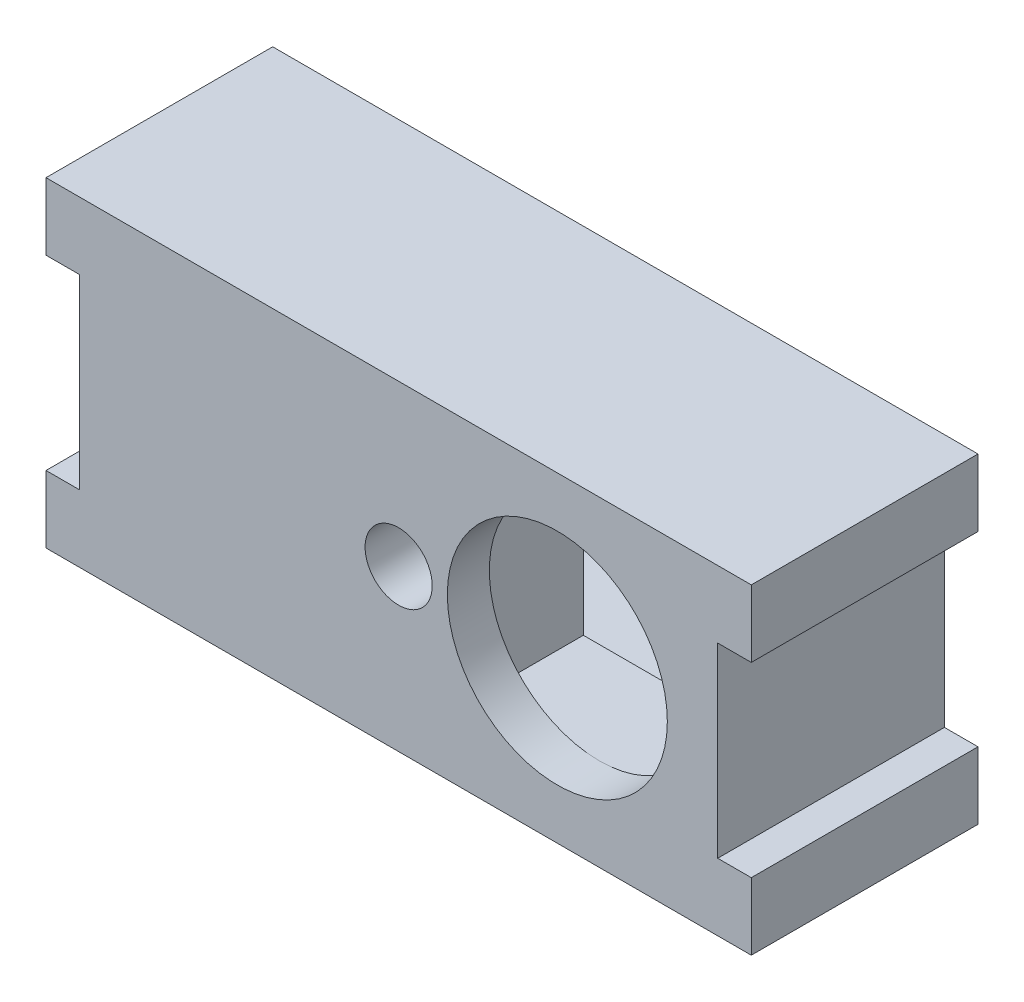
ISO-10303-21;
HEADER;
FILE_DESCRIPTION(('STEP AP214'),'2;1');
FILE_NAME('part.step','',(''),(''),'','','');
FILE_SCHEMA(('AUTOMOTIVE_DESIGN { 1 0 10303 214 1 1 1 1 }'));
ENDSEC;
DATA;
#1=APPLICATION_CONTEXT('core data for automotive mechanical design processes');
#2=APPLICATION_PROTOCOL_DEFINITION('international standard','automotive_design',2000,#1);
#3=PRODUCT_CONTEXT('',#1,'mechanical');
#4=PRODUCT('Part','Part','',(#3));
#5=PRODUCT_RELATED_PRODUCT_CATEGORY('part','',(#4));
#6=PRODUCT_DEFINITION_FORMATION('','',#4);
#7=PRODUCT_DEFINITION_CONTEXT('part definition',#1,'design');
#8=PRODUCT_DEFINITION('design','',#6,#7);
#9=PRODUCT_DEFINITION_SHAPE('','',#8);
#10=(LENGTH_UNIT() NAMED_UNIT(*) SI_UNIT(.MILLI.,.METRE.));
#11=(NAMED_UNIT(*) PLANE_ANGLE_UNIT() SI_UNIT($,.RADIAN.));
#12=(NAMED_UNIT(*) SI_UNIT($,.STERADIAN.) SOLID_ANGLE_UNIT());
#13=UNCERTAINTY_MEASURE_WITH_UNIT(LENGTH_MEASURE(1.E-05),#10,'distance_accuracy_value','');
#14=(GEOMETRIC_REPRESENTATION_CONTEXT(3) GLOBAL_UNCERTAINTY_ASSIGNED_CONTEXT((#13)) GLOBAL_UNIT_ASSIGNED_CONTEXT((#10,
#11,#12)) REPRESENTATION_CONTEXT('',''));
#15=CARTESIAN_POINT('',(0.,0.,0.));
#16=DIRECTION('',(0.,0.,1.));
#17=DIRECTION('',(1.,0.,0.));
#18=AXIS2_PLACEMENT_3D('',#15,#16,#17);
#19=CARTESIAN_POINT('',(-19.,9.55,-2.5));
#20=DIRECTION('',(-1.,0.,0.));
#21=DIRECTION('',(0.,-1.,0.));
#22=AXIS2_PLACEMENT_3D('',#19,#20,#21);
#23=PLANE('',#22);
#24=DIRECTION('',(0.,-1.,0.));
#25=VECTOR('',#24,1.);
#26=CARTESIAN_POINT('',(-19.,9.55,0.));
#27=LINE('',#26,#25);
#28=CARTESIAN_POINT('',(-19.,5.55,0.));
#29=VERTEX_POINT('',#28);
#30=CARTESIAN_POINT('',(-19.,-5.55,0.));
#31=VERTEX_POINT('',#30);
#32=EDGE_CURVE('E64',#29,#31,#27,.T.);
#33=ORIENTED_EDGE('',*,*,#32,.F.);
#34=DIRECTION('',(0.,0.,-1.));
#35=VECTOR('',#34,1.);
#36=CARTESIAN_POINT('',(-19.,5.55,4.47213595499958));
#37=LINE('',#36,#35);
#38=CARTESIAN_POINT('',(-19.,5.55,-2.5));
#39=VERTEX_POINT('',#38);
#40=EDGE_CURVE('E245',#29,#39,#37,.T.);
#41=ORIENTED_EDGE('',*,*,#40,.T.);
#42=DIRECTION('',(0.,-1.,0.));
#43=VECTOR('',#42,1.);
#44=CARTESIAN_POINT('',(-19.,9.55,-2.5));
#45=LINE('',#44,#43);
#46=CARTESIAN_POINT('',(-19.,-5.55,-2.5));
#47=VERTEX_POINT('',#46);
#48=EDGE_CURVE('E488',#39,#47,#45,.T.);
#49=ORIENTED_EDGE('',*,*,#48,.T.);
#50=DIRECTION('',(0.,0.,-1.));
#51=VECTOR('',#50,1.);
#52=CARTESIAN_POINT('',(-19.,-5.55,4.47213595499958));
#53=LINE('',#52,#51);
#54=EDGE_CURVE('E273',#31,#47,#53,.T.);
#55=ORIENTED_EDGE('',*,*,#54,.F.);
#56=EDGE_LOOP('',(#33,#41,#49,#55));
#57=FACE_BOUND('',#56,.T.);
#58=ADVANCED_FACE('F45',(#57),#23,.T.);
#59=CARTESIAN_POINT('',(19.,9.55,-2.5));
#60=DIRECTION('',(1.,0.,0.));
#61=DIRECTION('',(0.,0.,-1.));
#62=AXIS2_PLACEMENT_3D('',#59,#60,#61);
#63=PLANE('',#62);
#64=DIRECTION('',(0.,0.,-1.));
#65=VECTOR('',#64,1.);
#66=CARTESIAN_POINT('',(19.,5.55,4.47213595499958));
#67=LINE('',#66,#65);
#68=CARTESIAN_POINT('',(19.,5.55,0.));
#69=VERTEX_POINT('',#68);
#70=CARTESIAN_POINT('',(19.,5.55,-13.5));
#71=VERTEX_POINT('',#70);
#72=EDGE_CURVE('E288',#69,#71,#67,.T.);
#73=ORIENTED_EDGE('',*,*,#72,.F.);
#74=DIRECTION('',(0.,1.,0.));
#75=VECTOR('',#74,1.);
#76=CARTESIAN_POINT('',(19.,9.55,0.));
#77=LINE('',#76,#75);
#78=CARTESIAN_POINT('',(19.,-5.55,0.));
#79=VERTEX_POINT('',#78);
#80=EDGE_CURVE('E49',#79,#69,#77,.T.);
#81=ORIENTED_EDGE('',*,*,#80,.F.);
#82=DIRECTION('',(0.,0.,-1.));
#83=VECTOR('',#82,1.);
#84=CARTESIAN_POINT('',(19.,-5.55,4.47213595499958));
#85=LINE('',#84,#83);
#86=CARTESIAN_POINT('',(19.,-5.55,-13.5));
#87=VERTEX_POINT('',#86);
#88=EDGE_CURVE('E322',#79,#87,#85,.T.);
#89=ORIENTED_EDGE('',*,*,#88,.T.);
#90=DIRECTION('',(0.,-1.,0.));
#91=VECTOR('',#90,1.);
#92=CARTESIAN_POINT('',(19.,-9.55,-13.5));
#93=LINE('',#92,#91);
#94=EDGE_CURVE('E332',#71,#87,#93,.T.);
#95=ORIENTED_EDGE('',*,*,#94,.F.);
#96=EDGE_LOOP('',(#73,#81,#89,#95));
#97=FACE_BOUND('',#96,.T.);
#98=ADVANCED_FACE('F572',(#97),#63,.T.);
#99=CARTESIAN_POINT('',(0.,0.,-2.5));
#100=DIRECTION('',(0.,0.,-1.));
#101=DIRECTION('',(-1.,0.,0.));
#102=AXIS2_PLACEMENT_3D('',#99,#100,#101);
#103=PLANE('',#102);
#104=DIRECTION('',(1.,0.,0.));
#105=VECTOR('',#104,1.);
#106=CARTESIAN_POINT('',(2.5,6.55,-2.5));
#107=LINE('',#106,#105);
#108=CARTESIAN_POINT('',(9.45,6.55,-2.5));
#109=VERTEX_POINT('',#108);
#110=CARTESIAN_POINT('',(16.,6.55,-2.5));
#111=VERTEX_POINT('',#110);
#112=EDGE_CURVE('E432',#109,#111,#107,.T.);
#113=ORIENTED_EDGE('',*,*,#112,.T.);
#114=DIRECTION('',(0.,-1.,0.));
#115=VECTOR('',#114,1.);
#116=CARTESIAN_POINT('',(16.,6.55,-2.5));
#117=LINE('',#116,#115);
#118=CARTESIAN_POINT('',(16.,0.,-2.5));
#119=VERTEX_POINT('',#118);
#120=EDGE_CURVE('E57',#111,#119,#117,.T.);
#121=ORIENTED_EDGE('',*,*,#120,.T.);
#122=CARTESIAN_POINT('',(9.45,0.,-2.5));
#123=DIRECTION('',(0.,0.,1.));
#124=DIRECTION('',(1.,0.,0.));
#125=AXIS2_PLACEMENT_3D('',#122,#123,#124);
#126=CIRCLE('',#125,6.55);
#127=EDGE_CURVE('E478',#119,#109,#126,.T.);
#128=ORIENTED_EDGE('',*,*,#127,.T.);
#129=EDGE_LOOP('',(#113,#121,#128));
#130=FACE_BOUND('',#129,.T.);
#131=ADVANCED_FACE('F534',(#130),#103,.T.);
#132=CARTESIAN_POINT('',(9.45,-6.55,-2.5));
#133=VERTEX_POINT('',#132);
#134=EDGE_CURVE('E484',#133,#119,#126,.T.);
#135=ORIENTED_EDGE('',*,*,#134,.T.);
#136=CARTESIAN_POINT('',(16.,-6.55,-2.5));
#137=VERTEX_POINT('',#136);
#138=EDGE_CURVE('E11',#119,#137,#117,.T.);
#139=ORIENTED_EDGE('',*,*,#138,.T.);
#140=DIRECTION('',(-1.,0.,0.));
#141=VECTOR('',#140,1.);
#142=CARTESIAN_POINT('',(2.5,-6.55,-2.5));
#143=LINE('',#142,#141);
#144=EDGE_CURVE('E421',#137,#133,#143,.T.);
#145=ORIENTED_EDGE('',*,*,#144,.T.);
#146=EDGE_LOOP('',(#135,#139,#145));
#147=FACE_BOUND('',#146,.T.);
#148=ADVANCED_FACE('F539',(#147),#103,.T.);
#149=EDGE_CURVE('E483',#109,#133,#126,.T.);
#150=ORIENTED_EDGE('',*,*,#149,.T.);
#151=CARTESIAN_POINT('',(2.5,-6.55,-2.5));
#152=VERTEX_POINT('',#151);
#153=EDGE_CURVE('E55',#133,#152,#143,.T.);
#154=ORIENTED_EDGE('',*,*,#153,.T.);
#155=DIRECTION('',(0.,1.,0.));
#156=VECTOR('',#155,1.);
#157=CARTESIAN_POINT('',(2.5,6.55,-2.5));
#158=LINE('',#157,#156);
#159=CARTESIAN_POINT('',(2.5,6.55,-2.5));
#160=VERTEX_POINT('',#159);
#161=EDGE_CURVE('E425',#152,#160,#158,.T.);
#162=ORIENTED_EDGE('',*,*,#161,.T.);
#163=EDGE_CURVE('E408',#160,#109,#107,.T.);
#164=ORIENTED_EDGE('',*,*,#163,.T.);
#165=EDGE_LOOP('',(#150,#154,#162,#164));
#166=FACE_BOUND('',#165,.T.);
#167=ADVANCED_FACE('F525',(#166),#103,.T.);
#168=CARTESIAN_POINT('',(-19.,9.55,-2.5));
#169=DIRECTION('',(0.,1.,0.));
#170=DIRECTION('',(0.,0.,1.));
#171=AXIS2_PLACEMENT_3D('',#168,#169,#170);
#172=PLANE('',#171);
#173=DIRECTION('',(-1.,0.,0.));
#174=VECTOR('',#173,1.);
#175=CARTESIAN_POINT('',(-19.,9.55,0.));
#176=LINE('',#175,#174);
#177=CARTESIAN_POINT('',(21.,9.55,0.));
#178=VERTEX_POINT('',#177);
#179=CARTESIAN_POINT('',(-21.,9.55,0.));
#180=VERTEX_POINT('',#179);
#181=EDGE_CURVE('E482',#178,#180,#176,.T.);
#182=ORIENTED_EDGE('',*,*,#181,.F.);
#183=DIRECTION('',(0.,0.,-1.));
#184=VECTOR('',#183,1.);
#185=CARTESIAN_POINT('',(21.,9.55,4.47213595499958));
#186=LINE('',#185,#184);
#187=CARTESIAN_POINT('',(21.,9.55,-13.5));
#188=VERTEX_POINT('',#187);
#189=EDGE_CURVE('E300',#178,#188,#186,.T.);
#190=ORIENTED_EDGE('',*,*,#189,.T.);
#191=DIRECTION('',(1.,0.,0.));
#192=VECTOR('',#191,1.);
#193=CARTESIAN_POINT('',(19.,9.55,-13.5));
#194=LINE('',#193,#192);
#195=CARTESIAN_POINT('',(-21.,9.55,-13.5));
#196=VERTEX_POINT('',#195);
#197=EDGE_CURVE('E233',#196,#188,#194,.T.);
#198=ORIENTED_EDGE('',*,*,#197,.F.);
#199=DIRECTION('',(0.,0.,-1.));
#200=VECTOR('',#199,1.);
#201=CARTESIAN_POINT('',(-21.,9.55,4.47213595499958));
#202=LINE('',#201,#200);
#203=EDGE_CURVE('E244',#180,#196,#202,.T.);
#204=ORIENTED_EDGE('',*,*,#203,.F.);
#205=EDGE_LOOP('',(#182,#190,#198,#204));
#206=FACE_BOUND('',#205,.T.);
#207=ADVANCED_FACE('F47',(#206),#172,.T.);
#208=CARTESIAN_POINT('',(-19.,-9.55,-2.5));
#209=DIRECTION('',(0.,-1.,0.));
#210=DIRECTION('',(0.,0.,-1.));
#211=AXIS2_PLACEMENT_3D('',#208,#209,#210);
#212=PLANE('',#211);
#213=DIRECTION('',(1.,0.,0.));
#214=VECTOR('',#213,1.);
#215=CARTESIAN_POINT('',(-19.,-9.55,0.));
#216=LINE('',#215,#214);
#217=CARTESIAN_POINT('',(-21.,-9.55,0.));
#218=VERTEX_POINT('',#217);
#219=CARTESIAN_POINT('',(21.,-9.55,0.));
#220=VERTEX_POINT('',#219);
#221=EDGE_CURVE('E495',#218,#220,#216,.T.);
#222=ORIENTED_EDGE('',*,*,#221,.F.);
#223=DIRECTION('',(0.,0.,-1.));
#224=VECTOR('',#223,1.);
#225=CARTESIAN_POINT('',(-21.,-9.55,4.47213595499958));
#226=LINE('',#225,#224);
#227=CARTESIAN_POINT('',(-21.,-9.55,-13.5));
#228=VERTEX_POINT('',#227);
#229=EDGE_CURVE('E277',#218,#228,#226,.T.);
#230=ORIENTED_EDGE('',*,*,#229,.T.);
#231=DIRECTION('',(-1.,0.,0.));
#232=VECTOR('',#231,1.);
#233=CARTESIAN_POINT('',(19.,-9.55,-13.5));
#234=LINE('',#233,#232);
#235=CARTESIAN_POINT('',(21.,-9.55,-13.5));
#236=VERTEX_POINT('',#235);
#237=EDGE_CURVE('E336',#236,#228,#234,.T.);
#238=ORIENTED_EDGE('',*,*,#237,.F.);
#239=DIRECTION('',(0.,0.,-1.));
#240=VECTOR('',#239,1.);
#241=CARTESIAN_POINT('',(21.,-9.55,4.47213595499958));
#242=LINE('',#241,#240);
#243=EDGE_CURVE('E318',#220,#236,#242,.T.);
#244=ORIENTED_EDGE('',*,*,#243,.F.);
#245=EDGE_LOOP('',(#222,#230,#238,#244));
#246=FACE_BOUND('',#245,.T.);
#247=ADVANCED_FACE('F580',(#246),#212,.T.);
#248=DIRECTION('',(-1.,0.,0.));
#249=VECTOR('',#248,1.);
#250=CARTESIAN_POINT('',(-2.5,5.55,-2.5));
#251=LINE('',#250,#249);
#252=CARTESIAN_POINT('',(-2.5,5.55,-2.5));
#253=VERTEX_POINT('',#252);
#254=EDGE_CURVE('E450',#253,#39,#251,.T.);
#255=ORIENTED_EDGE('',*,*,#254,.F.);
#256=DIRECTION('',(0.,1.,0.));
#257=VECTOR('',#256,1.);
#258=CARTESIAN_POINT('',(-2.5,-5.55,-2.5));
#259=LINE('',#258,#257);
#260=CARTESIAN_POINT('',(-2.5,-5.55,-2.5));
#261=VERTEX_POINT('',#260);
#262=EDGE_CURVE('E460',#261,#253,#259,.T.);
#263=ORIENTED_EDGE('',*,*,#262,.F.);
#264=DIRECTION('',(1.,0.,0.));
#265=VECTOR('',#264,1.);
#266=CARTESIAN_POINT('',(-19.,-5.55,-2.5));
#267=LINE('',#266,#265);
#268=EDGE_CURVE('E445',#47,#261,#267,.T.);
#269=ORIENTED_EDGE('',*,*,#268,.F.);
#270=ORIENTED_EDGE('',*,*,#48,.F.);
#271=EDGE_LOOP('',(#255,#263,#269,#270));
#272=FACE_BOUND('',#271,.T.);
#273=ADVANCED_FACE('F582',(#272),#103,.T.);
#274=CARTESIAN_POINT('',(0.,0.,0.));
#275=DIRECTION('',(0.,0.,-1.));
#276=DIRECTION('',(-1.,0.,0.));
#277=AXIS2_PLACEMENT_3D('',#274,#275,#276);
#278=PLANE('',#277);
#279=CARTESIAN_POINT('',(0.,0.,0.));
#280=DIRECTION('',(0.,0.,1.));
#281=DIRECTION('',(1.,0.,0.));
#282=AXIS2_PLACEMENT_3D('',#279,#280,#281);
#283=CIRCLE('',#282,2.);
#284=CARTESIAN_POINT('',(2.,0.,0.));
#285=VERTEX_POINT('',#284);
#286=EDGE_CURVE('E473',#285,#285,#283,.T.);
#287=ORIENTED_EDGE('',*,*,#286,.F.);
#288=EDGE_LOOP('',(#287));
#289=FACE_BOUND('',#288,.T.);
#290=CARTESIAN_POINT('',(9.45,0.,0.));
#291=DIRECTION('',(0.,0.,1.));
#292=DIRECTION('',(1.,0.,0.));
#293=AXIS2_PLACEMENT_3D('',#290,#291,#292);
#294=CIRCLE('',#293,6.55);
#295=CARTESIAN_POINT('',(16.,0.,0.));
#296=VERTEX_POINT('',#295);
#297=EDGE_CURVE('E477',#296,#296,#294,.T.);
#298=ORIENTED_EDGE('',*,*,#297,.F.);
#299=EDGE_LOOP('',(#298));
#300=FACE_BOUND('',#299,.T.);
#301=ORIENTED_EDGE('',*,*,#181,.T.);
#302=DIRECTION('',(0.,1.,0.));
#303=VECTOR('',#302,1.);
#304=CARTESIAN_POINT('',(-21.,9.55,0.));
#305=LINE('',#304,#303);
#306=CARTESIAN_POINT('',(-21.,5.55,0.));
#307=VERTEX_POINT('',#306);
#308=EDGE_CURVE('E260',#307,#180,#305,.T.);
#309=ORIENTED_EDGE('',*,*,#308,.F.);
#310=DIRECTION('',(-1.,0.,0.));
#311=VECTOR('',#310,1.);
#312=CARTESIAN_POINT('',(-21.,5.55,0.));
#313=LINE('',#312,#311);
#314=EDGE_CURVE('E240',#29,#307,#313,.T.);
#315=ORIENTED_EDGE('',*,*,#314,.F.);
#316=ORIENTED_EDGE('',*,*,#32,.T.);
#317=DIRECTION('',(1.,0.,0.));
#318=VECTOR('',#317,1.);
#319=CARTESIAN_POINT('',(-21.,-5.55,0.));
#320=LINE('',#319,#318);
#321=CARTESIAN_POINT('',(-21.,-5.55,0.));
#322=VERTEX_POINT('',#321);
#323=EDGE_CURVE('E251',#322,#31,#320,.T.);
#324=ORIENTED_EDGE('',*,*,#323,.F.);
#325=DIRECTION('',(0.,1.,0.));
#326=VECTOR('',#325,1.);
#327=CARTESIAN_POINT('',(-21.,-9.55,0.));
#328=LINE('',#327,#326);
#329=EDGE_CURVE('E256',#218,#322,#328,.T.);
#330=ORIENTED_EDGE('',*,*,#329,.F.);
#331=ORIENTED_EDGE('',*,*,#221,.T.);
#332=DIRECTION('',(0.,1.,0.));
#333=VECTOR('',#332,1.);
#334=CARTESIAN_POINT('',(21.,-9.55,0.));
#335=LINE('',#334,#333);
#336=CARTESIAN_POINT('',(21.,-5.55,0.));
#337=VERTEX_POINT('',#336);
#338=EDGE_CURVE('E310',#220,#337,#335,.T.);
#339=ORIENTED_EDGE('',*,*,#338,.T.);
#340=DIRECTION('',(-1.,0.,0.));
#341=VECTOR('',#340,1.);
#342=CARTESIAN_POINT('',(21.,-5.55,0.));
#343=LINE('',#342,#341);
#344=EDGE_CURVE('E313',#337,#79,#343,.T.);
#345=ORIENTED_EDGE('',*,*,#344,.T.);
#346=ORIENTED_EDGE('',*,*,#80,.T.);
#347=DIRECTION('',(1.,0.,0.));
#348=VECTOR('',#347,1.);
#349=CARTESIAN_POINT('',(21.,5.55,0.));
#350=LINE('',#349,#348);
#351=CARTESIAN_POINT('',(21.,5.55,0.));
#352=VERTEX_POINT('',#351);
#353=EDGE_CURVE('E287',#69,#352,#350,.T.);
#354=ORIENTED_EDGE('',*,*,#353,.T.);
#355=DIRECTION('',(0.,1.,0.));
#356=VECTOR('',#355,1.);
#357=CARTESIAN_POINT('',(21.,9.55,0.));
#358=LINE('',#357,#356);
#359=EDGE_CURVE('E283',#352,#178,#358,.T.);
#360=ORIENTED_EDGE('',*,*,#359,.T.);
#361=EDGE_LOOP('',(#301,#309,#315,#316,#324,#330,#331,#339,#345,#346,#354,#360));
#362=FACE_BOUND('',#361,.T.);
#363=ADVANCED_FACE('F504',(#289,#300,#362),#278,.F.);
#364=CARTESIAN_POINT('',(9.45,0.,-2.5));
#365=DIRECTION('',(0.,0.,1.));
#366=DIRECTION('',(1.,0.,0.));
#367=AXIS2_PLACEMENT_3D('',#364,#365,#366);
#368=CYLINDRICAL_SURFACE('',#367,6.55);
#369=ORIENTED_EDGE('',*,*,#127,.F.);
#370=ORIENTED_EDGE('',*,*,#134,.F.);
#371=ORIENTED_EDGE('',*,*,#149,.F.);
#372=EDGE_LOOP('',(#369,#370,#371));
#373=FACE_BOUND('',#372,.T.);
#374=ORIENTED_EDGE('',*,*,#297,.T.);
#375=EDGE_LOOP('',(#374));
#376=FACE_BOUND('',#375,.T.);
#377=ADVANCED_FACE('F530',(#373,#376),#368,.F.);
#378=CARTESIAN_POINT('',(0.,0.,-2.5));
#379=DIRECTION('',(0.,0.,1.));
#380=DIRECTION('',(1.,0.,0.));
#381=AXIS2_PLACEMENT_3D('',#378,#379,#380);
#382=CYLINDRICAL_SURFACE('',#381,2.);
#383=ORIENTED_EDGE('',*,*,#286,.T.);
#384=EDGE_LOOP('',(#383));
#385=FACE_BOUND('',#384,.T.);
#386=CARTESIAN_POINT('',(0.,0.,-8.5));
#387=DIRECTION('',(0.,0.,-1.));
#388=DIRECTION('',(-1.,0.,0.));
#389=AXIS2_PLACEMENT_3D('',#386,#387,#388);
#390=CIRCLE('',#389,2.);
#391=CARTESIAN_POINT('',(-2.,0.,-8.5));
#392=VERTEX_POINT('',#391);
#393=EDGE_CURVE('E400',#392,#392,#390,.T.);
#394=ORIENTED_EDGE('',*,*,#393,.T.);
#395=EDGE_LOOP('',(#394));
#396=FACE_BOUND('',#395,.T.);
#397=ADVANCED_FACE('F593',(#385,#396),#382,.F.);
#398=CARTESIAN_POINT('',(0.,0.,-8.5));
#399=DIRECTION('',(0.,0.,-1.));
#400=DIRECTION('',(-1.,0.,0.));
#401=AXIS2_PLACEMENT_3D('',#398,#399,#400);
#402=PLANE('',#401);
#403=DIRECTION('',(0.,-1.,0.));
#404=VECTOR('',#403,1.);
#405=CARTESIAN_POINT('',(-16.5,5.55,-8.5));
#406=LINE('',#405,#404);
#407=CARTESIAN_POINT('',(-16.5,7.05,-8.5));
#408=VERTEX_POINT('',#407);
#409=CARTESIAN_POINT('',(-16.5,5.55,-8.5));
#410=VERTEX_POINT('',#409);
#411=EDGE_CURVE('E337',#408,#410,#406,.T.);
#412=ORIENTED_EDGE('',*,*,#411,.F.);
#413=DIRECTION('',(-1.,0.,0.));
#414=VECTOR('',#413,1.);
#415=CARTESIAN_POINT('',(-16.5,7.05,-8.5));
#416=LINE('',#415,#414);
#417=CARTESIAN_POINT('',(16.5,7.05,-8.5));
#418=VERTEX_POINT('',#417);
#419=EDGE_CURVE('E371',#418,#408,#416,.T.);
#420=ORIENTED_EDGE('',*,*,#419,.F.);
#421=DIRECTION('',(0.,1.,0.));
#422=VECTOR('',#421,1.);
#423=CARTESIAN_POINT('',(16.5,7.05,-8.5));
#424=LINE('',#423,#422);
#425=CARTESIAN_POINT('',(16.5,-7.05,-8.5));
#426=VERTEX_POINT('',#425);
#427=EDGE_CURVE('E367',#426,#418,#424,.T.);
#428=ORIENTED_EDGE('',*,*,#427,.F.);
#429=DIRECTION('',(1.,0.,0.));
#430=VECTOR('',#429,1.);
#431=CARTESIAN_POINT('',(16.5,-7.05,-8.5));
#432=LINE('',#431,#430);
#433=CARTESIAN_POINT('',(-16.5,-7.05,-8.5));
#434=VERTEX_POINT('',#433);
#435=EDGE_CURVE('E363',#434,#426,#432,.T.);
#436=ORIENTED_EDGE('',*,*,#435,.F.);
#437=DIRECTION('',(0.,-1.,0.));
#438=VECTOR('',#437,1.);
#439=CARTESIAN_POINT('',(-16.5,-7.05,-8.5));
#440=LINE('',#439,#438);
#441=CARTESIAN_POINT('',(-16.5,-5.55,-8.5));
#442=VERTEX_POINT('',#441);
#443=EDGE_CURVE('E291',#442,#434,#440,.T.);
#444=ORIENTED_EDGE('',*,*,#443,.F.);
#445=DIRECTION('',(1.,0.,0.));
#446=VECTOR('',#445,1.);
#447=CARTESIAN_POINT('',(-19.,-5.55,-8.5));
#448=LINE('',#447,#446);
#449=CARTESIAN_POINT('',(-2.5,-5.55,-8.5));
#450=VERTEX_POINT('',#449);
#451=EDGE_CURVE('E446',#442,#450,#448,.T.);
#452=ORIENTED_EDGE('',*,*,#451,.T.);
#453=DIRECTION('',(0.,1.,0.));
#454=VECTOR('',#453,1.);
#455=CARTESIAN_POINT('',(-2.5,-5.55,-8.5));
#456=LINE('',#455,#454);
#457=CARTESIAN_POINT('',(-2.5,5.55,-8.5));
#458=VERTEX_POINT('',#457);
#459=EDGE_CURVE('E449',#450,#458,#456,.T.);
#460=ORIENTED_EDGE('',*,*,#459,.T.);
#461=DIRECTION('',(-1.,0.,0.));
#462=VECTOR('',#461,1.);
#463=CARTESIAN_POINT('',(-2.5,5.55,-8.5));
#464=LINE('',#463,#462);
#465=EDGE_CURVE('E453',#458,#410,#464,.T.);
#466=ORIENTED_EDGE('',*,*,#465,.T.);
#467=EDGE_LOOP('',(#412,#420,#428,#436,#444,#452,#460,#466));
#468=FACE_BOUND('',#467,.T.);
#469=DIRECTION('',(-1.,0.,0.));
#470=VECTOR('',#469,1.);
#471=CARTESIAN_POINT('',(2.5,-6.55,-8.5));
#472=LINE('',#471,#470);
#473=CARTESIAN_POINT('',(16.,-6.55,-8.5));
#474=VERTEX_POINT('',#473);
#475=CARTESIAN_POINT('',(2.5,-6.55,-8.5));
#476=VERTEX_POINT('',#475);
#477=EDGE_CURVE('E407',#474,#476,#472,.T.);
#478=ORIENTED_EDGE('',*,*,#477,.F.);
#479=DIRECTION('',(0.,-1.,0.));
#480=VECTOR('',#479,1.);
#481=CARTESIAN_POINT('',(16.,6.55,-8.5));
#482=LINE('',#481,#480);
#483=CARTESIAN_POINT('',(16.,6.55,-8.5));
#484=VERTEX_POINT('',#483);
#485=EDGE_CURVE('E404',#484,#474,#482,.T.);
#486=ORIENTED_EDGE('',*,*,#485,.F.);
#487=DIRECTION('',(1.,0.,0.));
#488=VECTOR('',#487,1.);
#489=CARTESIAN_POINT('',(2.5,6.55,-8.5));
#490=LINE('',#489,#488);
#491=CARTESIAN_POINT('',(2.5,6.55,-8.5));
#492=VERTEX_POINT('',#491);
#493=EDGE_CURVE('E415',#492,#484,#490,.T.);
#494=ORIENTED_EDGE('',*,*,#493,.F.);
#495=DIRECTION('',(0.,1.,0.));
#496=VECTOR('',#495,1.);
#497=CARTESIAN_POINT('',(2.5,6.55,-8.5));
#498=LINE('',#497,#496);
#499=EDGE_CURVE('E411',#476,#492,#498,.T.);
#500=ORIENTED_EDGE('',*,*,#499,.F.);
#501=EDGE_LOOP('',(#478,#486,#494,#500));
#502=FACE_BOUND('',#501,.T.);
#503=ORIENTED_EDGE('',*,*,#393,.F.);
#504=EDGE_LOOP('',(#503));
#505=FACE_BOUND('',#504,.T.);
#506=ADVANCED_FACE('F548',(#468,#502,#505),#402,.T.);
#507=CARTESIAN_POINT('',(-19.,-5.55,-8.5));
#508=DIRECTION('',(0.,-1.,0.));
#509=DIRECTION('',(1.,0.,0.));
#510=AXIS2_PLACEMENT_3D('',#507,#508,#509);
#511=PLANE('',#510);
#512=ORIENTED_EDGE('',*,*,#268,.T.);
#513=DIRECTION('',(0.,0.,1.));
#514=VECTOR('',#513,1.);
#515=CARTESIAN_POINT('',(-2.5,-5.55,-8.5));
#516=LINE('',#515,#514);
#517=EDGE_CURVE('E469',#450,#261,#516,.T.);
#518=ORIENTED_EDGE('',*,*,#517,.F.);
#519=ORIENTED_EDGE('',*,*,#451,.F.);
#520=DIRECTION('',(0.,0.,1.));
#521=VECTOR('',#520,1.);
#522=CARTESIAN_POINT('',(-16.5,-5.55,-13.5));
#523=LINE('',#522,#521);
#524=CARTESIAN_POINT('',(-16.5,-5.55,-13.5));
#525=VERTEX_POINT('',#524);
#526=EDGE_CURVE('E396',#525,#442,#523,.T.);
#527=ORIENTED_EDGE('',*,*,#526,.F.);
#528=DIRECTION('',(1.,0.,0.));
#529=VECTOR('',#528,1.);
#530=CARTESIAN_POINT('',(-19.,-5.55,-13.5));
#531=LINE('',#530,#529);
#532=CARTESIAN_POINT('',(-21.,-5.55,-13.5));
#533=VERTEX_POINT('',#532);
#534=EDGE_CURVE('E340',#533,#525,#531,.T.);
#535=ORIENTED_EDGE('',*,*,#534,.F.);
#536=DIRECTION('',(0.,0.,-1.));
#537=VECTOR('',#536,1.);
#538=CARTESIAN_POINT('',(-21.,-5.55,4.47213595499958));
#539=LINE('',#538,#537);
#540=EDGE_CURVE('E267',#322,#533,#539,.T.);
#541=ORIENTED_EDGE('',*,*,#540,.F.);
#542=ORIENTED_EDGE('',*,*,#323,.T.);
#543=ORIENTED_EDGE('',*,*,#54,.T.);
#544=EDGE_LOOP('',(#512,#518,#519,#527,#535,#541,#542,#543));
#545=FACE_BOUND('',#544,.T.);
#546=ADVANCED_FACE('F597',(#545),#511,.F.);
#547=CARTESIAN_POINT('',(-2.5,-5.55,-8.5));
#548=DIRECTION('',(1.,0.,0.));
#549=DIRECTION('',(0.,1.,0.));
#550=AXIS2_PLACEMENT_3D('',#547,#548,#549);
#551=PLANE('',#550);
#552=ORIENTED_EDGE('',*,*,#262,.T.);
#553=DIRECTION('',(0.,0.,1.));
#554=VECTOR('',#553,1.);
#555=CARTESIAN_POINT('',(-2.5,5.55,-8.5));
#556=LINE('',#555,#554);
#557=EDGE_CURVE('E456',#458,#253,#556,.T.);
#558=ORIENTED_EDGE('',*,*,#557,.F.);
#559=ORIENTED_EDGE('',*,*,#459,.F.);
#560=ORIENTED_EDGE('',*,*,#517,.T.);
#561=EDGE_LOOP('',(#552,#558,#559,#560));
#562=FACE_BOUND('',#561,.T.);
#563=ADVANCED_FACE('F600',(#562),#551,.F.);
#564=CARTESIAN_POINT('',(-2.5,5.55,-8.5));
#565=DIRECTION('',(0.,1.,0.));
#566=DIRECTION('',(0.,0.,1.));
#567=AXIS2_PLACEMENT_3D('',#564,#565,#566);
#568=PLANE('',#567);
#569=ORIENTED_EDGE('',*,*,#254,.T.);
#570=ORIENTED_EDGE('',*,*,#40,.F.);
#571=ORIENTED_EDGE('',*,*,#314,.T.);
#572=DIRECTION('',(0.,0.,-1.));
#573=VECTOR('',#572,1.);
#574=CARTESIAN_POINT('',(-21.,5.55,4.47213595499958));
#575=LINE('',#574,#573);
#576=CARTESIAN_POINT('',(-21.,5.55,-13.5));
#577=VERTEX_POINT('',#576);
#578=EDGE_CURVE('E237',#307,#577,#575,.T.);
#579=ORIENTED_EDGE('',*,*,#578,.T.);
#580=DIRECTION('',(-1.,0.,0.));
#581=VECTOR('',#580,1.);
#582=CARTESIAN_POINT('',(-19.,5.55,-13.5));
#583=LINE('',#582,#581);
#584=CARTESIAN_POINT('',(-16.5,5.55,-13.5));
#585=VERTEX_POINT('',#584);
#586=EDGE_CURVE('E222',#585,#577,#583,.T.);
#587=ORIENTED_EDGE('',*,*,#586,.F.);
#588=DIRECTION('',(0.,0.,1.));
#589=VECTOR('',#588,1.);
#590=CARTESIAN_POINT('',(-16.5,5.55,-13.5));
#591=LINE('',#590,#589);
#592=EDGE_CURVE('E359',#585,#410,#591,.T.);
#593=ORIENTED_EDGE('',*,*,#592,.T.);
#594=ORIENTED_EDGE('',*,*,#465,.F.);
#595=ORIENTED_EDGE('',*,*,#557,.T.);
#596=EDGE_LOOP('',(#569,#570,#571,#579,#587,#593,#594,#595));
#597=FACE_BOUND('',#596,.T.);
#598=ADVANCED_FACE('F238',(#597),#568,.F.);
#599=CARTESIAN_POINT('',(16.,6.55,-8.5));
#600=DIRECTION('',(-1.,0.,0.));
#601=DIRECTION('',(0.,0.,1.));
#602=AXIS2_PLACEMENT_3D('',#599,#600,#601);
#603=PLANE('',#602);
#604=ORIENTED_EDGE('',*,*,#120,.F.);
#605=DIRECTION('',(0.,0.,1.));
#606=VECTOR('',#605,1.);
#607=CARTESIAN_POINT('',(16.,6.55,-8.5));
#608=LINE('',#607,#606);
#609=EDGE_CURVE('E417',#484,#111,#608,.T.);
#610=ORIENTED_EDGE('',*,*,#609,.F.);
#611=ORIENTED_EDGE('',*,*,#485,.T.);
#612=DIRECTION('',(0.,0.,1.));
#613=VECTOR('',#612,1.);
#614=CARTESIAN_POINT('',(16.,-6.55,-8.5));
#615=LINE('',#614,#613);
#616=EDGE_CURVE('E441',#474,#137,#615,.T.);
#617=ORIENTED_EDGE('',*,*,#616,.T.);
#618=ORIENTED_EDGE('',*,*,#138,.F.);
#619=EDGE_LOOP('',(#604,#610,#611,#617,#618));
#620=FACE_BOUND('',#619,.T.);
#621=ADVANCED_FACE('F544',(#620),#603,.T.);
#622=CARTESIAN_POINT('',(2.5,-6.55,-8.5));
#623=DIRECTION('',(0.,1.,0.));
#624=DIRECTION('',(0.,0.,1.));
#625=AXIS2_PLACEMENT_3D('',#622,#623,#624);
#626=PLANE('',#625);
#627=ORIENTED_EDGE('',*,*,#144,.F.);
#628=ORIENTED_EDGE('',*,*,#616,.F.);
#629=ORIENTED_EDGE('',*,*,#477,.T.);
#630=DIRECTION('',(0.,0.,1.));
#631=VECTOR('',#630,1.);
#632=CARTESIAN_POINT('',(2.5,-6.55,-8.5));
#633=LINE('',#632,#631);
#634=EDGE_CURVE('E438',#476,#152,#633,.T.);
#635=ORIENTED_EDGE('',*,*,#634,.T.);
#636=ORIENTED_EDGE('',*,*,#153,.F.);
#637=EDGE_LOOP('',(#627,#628,#629,#635,#636));
#638=FACE_BOUND('',#637,.T.);
#639=ADVANCED_FACE('F542',(#638),#626,.T.);
#640=CARTESIAN_POINT('',(2.5,6.55,-8.5));
#641=DIRECTION('',(1.,0.,0.));
#642=DIRECTION('',(0.,1.,0.));
#643=AXIS2_PLACEMENT_3D('',#640,#641,#642);
#644=PLANE('',#643);
#645=ORIENTED_EDGE('',*,*,#161,.F.);
#646=ORIENTED_EDGE('',*,*,#634,.F.);
#647=ORIENTED_EDGE('',*,*,#499,.T.);
#648=DIRECTION('',(0.,0.,1.));
#649=VECTOR('',#648,1.);
#650=CARTESIAN_POINT('',(2.5,6.55,-8.5));
#651=LINE('',#650,#649);
#652=EDGE_CURVE('E435',#492,#160,#651,.T.);
#653=ORIENTED_EDGE('',*,*,#652,.T.);
#654=EDGE_LOOP('',(#645,#646,#647,#653));
#655=FACE_BOUND('',#654,.T.);
#656=ADVANCED_FACE('F554',(#655),#644,.T.);
#657=CARTESIAN_POINT('',(2.5,6.55,-8.5));
#658=DIRECTION('',(0.,-1.,0.));
#659=DIRECTION('',(1.,0.,0.));
#660=AXIS2_PLACEMENT_3D('',#657,#658,#659);
#661=PLANE('',#660);
#662=ORIENTED_EDGE('',*,*,#163,.F.);
#663=ORIENTED_EDGE('',*,*,#652,.F.);
#664=ORIENTED_EDGE('',*,*,#493,.T.);
#665=ORIENTED_EDGE('',*,*,#609,.T.);
#666=ORIENTED_EDGE('',*,*,#112,.F.);
#667=EDGE_LOOP('',(#662,#663,#664,#665,#666));
#668=FACE_BOUND('',#667,.T.);
#669=ADVANCED_FACE('F556',(#668),#661,.T.);
#670=CARTESIAN_POINT('',(-16.5,-7.05,-13.5));
#671=DIRECTION('',(-1.,0.,0.));
#672=DIRECTION('',(0.,0.,1.));
#673=AXIS2_PLACEMENT_3D('',#670,#671,#672);
#674=PLANE('',#673);
#675=ORIENTED_EDGE('',*,*,#443,.T.);
#676=DIRECTION('',(0.,0.,1.));
#677=VECTOR('',#676,1.);
#678=CARTESIAN_POINT('',(-16.5,-7.05,-13.5));
#679=LINE('',#678,#677);
#680=CARTESIAN_POINT('',(-16.5,-7.05,-13.5));
#681=VERTEX_POINT('',#680);
#682=EDGE_CURVE('E392',#681,#434,#679,.T.);
#683=ORIENTED_EDGE('',*,*,#682,.F.);
#684=DIRECTION('',(0.,-1.,0.));
#685=VECTOR('',#684,1.);
#686=CARTESIAN_POINT('',(-16.5,-7.05,-13.5));
#687=LINE('',#686,#685);
#688=EDGE_CURVE('E343',#525,#681,#687,.T.);
#689=ORIENTED_EDGE('',*,*,#688,.F.);
#690=ORIENTED_EDGE('',*,*,#526,.T.);
#691=EDGE_LOOP('',(#675,#683,#689,#690));
#692=FACE_BOUND('',#691,.T.);
#693=ADVANCED_FACE('F560',(#692),#674,.F.);
#694=CARTESIAN_POINT('',(16.5,-7.05,-13.5));
#695=DIRECTION('',(0.,-1.,0.));
#696=DIRECTION('',(0.,0.,-1.));
#697=AXIS2_PLACEMENT_3D('',#694,#695,#696);
#698=PLANE('',#697);
#699=ORIENTED_EDGE('',*,*,#435,.T.);
#700=DIRECTION('',(0.,0.,1.));
#701=VECTOR('',#700,1.);
#702=CARTESIAN_POINT('',(16.5,-7.05,-13.5));
#703=LINE('',#702,#701);
#704=CARTESIAN_POINT('',(16.5,-7.05,-13.5));
#705=VERTEX_POINT('',#704);
#706=EDGE_CURVE('E388',#705,#426,#703,.T.);
#707=ORIENTED_EDGE('',*,*,#706,.F.);
#708=DIRECTION('',(1.,0.,0.));
#709=VECTOR('',#708,1.);
#710=CARTESIAN_POINT('',(16.5,-7.05,-13.5));
#711=LINE('',#710,#709);
#712=EDGE_CURVE('E346',#681,#705,#711,.T.);
#713=ORIENTED_EDGE('',*,*,#712,.F.);
#714=ORIENTED_EDGE('',*,*,#682,.T.);
#715=EDGE_LOOP('',(#699,#707,#713,#714));
#716=FACE_BOUND('',#715,.T.);
#717=ADVANCED_FACE('F567',(#716),#698,.F.);
#718=CARTESIAN_POINT('',(16.5,7.05,-13.5));
#719=DIRECTION('',(1.,0.,0.));
#720=DIRECTION('',(0.,0.,-1.));
#721=AXIS2_PLACEMENT_3D('',#718,#719,#720);
#722=PLANE('',#721);
#723=ORIENTED_EDGE('',*,*,#427,.T.);
#724=DIRECTION('',(0.,0.,1.));
#725=VECTOR('',#724,1.);
#726=CARTESIAN_POINT('',(16.5,7.05,-13.5));
#727=LINE('',#726,#725);
#728=CARTESIAN_POINT('',(16.5,7.05,-13.5));
#729=VERTEX_POINT('',#728);
#730=EDGE_CURVE('E384',#729,#418,#727,.T.);
#731=ORIENTED_EDGE('',*,*,#730,.F.);
#732=DIRECTION('',(0.,1.,0.));
#733=VECTOR('',#732,1.);
#734=CARTESIAN_POINT('',(16.5,7.05,-13.5));
#735=LINE('',#734,#733);
#736=EDGE_CURVE('E349',#705,#729,#735,.T.);
#737=ORIENTED_EDGE('',*,*,#736,.F.);
#738=ORIENTED_EDGE('',*,*,#706,.T.);
#739=EDGE_LOOP('',(#723,#731,#737,#738));
#740=FACE_BOUND('',#739,.T.);
#741=ADVANCED_FACE('F691',(#740),#722,.F.);
#742=CARTESIAN_POINT('',(-16.5,7.05,-13.5));
#743=DIRECTION('',(0.,1.,0.));
#744=DIRECTION('',(0.,0.,1.));
#745=AXIS2_PLACEMENT_3D('',#742,#743,#744);
#746=PLANE('',#745);
#747=ORIENTED_EDGE('',*,*,#419,.T.);
#748=DIRECTION('',(0.,0.,1.));
#749=VECTOR('',#748,1.);
#750=CARTESIAN_POINT('',(-16.5,7.05,-13.5));
#751=LINE('',#750,#749);
#752=CARTESIAN_POINT('',(-16.5,7.05,-13.5));
#753=VERTEX_POINT('',#752);
#754=EDGE_CURVE('E380',#753,#408,#751,.T.);
#755=ORIENTED_EDGE('',*,*,#754,.F.);
#756=DIRECTION('',(-1.,0.,0.));
#757=VECTOR('',#756,1.);
#758=CARTESIAN_POINT('',(-16.5,7.05,-13.5));
#759=LINE('',#758,#757);
#760=EDGE_CURVE('E352',#729,#753,#759,.T.);
#761=ORIENTED_EDGE('',*,*,#760,.F.);
#762=ORIENTED_EDGE('',*,*,#730,.T.);
#763=EDGE_LOOP('',(#747,#755,#761,#762));
#764=FACE_BOUND('',#763,.T.);
#765=ADVANCED_FACE('F701',(#764),#746,.F.);
#766=CARTESIAN_POINT('',(-16.5,5.55,-13.5));
#767=DIRECTION('',(-1.,0.,0.));
#768=DIRECTION('',(0.,0.,1.));
#769=AXIS2_PLACEMENT_3D('',#766,#767,#768);
#770=PLANE('',#769);
#771=ORIENTED_EDGE('',*,*,#411,.T.);
#772=ORIENTED_EDGE('',*,*,#592,.F.);
#773=DIRECTION('',(0.,-1.,0.));
#774=VECTOR('',#773,1.);
#775=CARTESIAN_POINT('',(-16.5,5.55,-13.5));
#776=LINE('',#775,#774);
#777=EDGE_CURVE('E228',#753,#585,#776,.T.);
#778=ORIENTED_EDGE('',*,*,#777,.F.);
#779=ORIENTED_EDGE('',*,*,#754,.T.);
#780=EDGE_LOOP('',(#771,#772,#778,#779));
#781=FACE_BOUND('',#780,.T.);
#782=ADVANCED_FACE('F711',(#781),#770,.F.);
#783=CARTESIAN_POINT('',(0.,0.,-13.5));
#784=DIRECTION('',(0.,0.,1.));
#785=DIRECTION('',(1.,0.,0.));
#786=AXIS2_PLACEMENT_3D('',#783,#784,#785);
#787=PLANE('',#786);
#788=ORIENTED_EDGE('',*,*,#197,.T.);
#789=DIRECTION('',(0.,-1.,0.));
#790=VECTOR('',#789,1.);
#791=CARTESIAN_POINT('',(21.,9.55,-13.5));
#792=LINE('',#791,#790);
#793=CARTESIAN_POINT('',(21.,5.55,-13.5));
#794=VERTEX_POINT('',#793);
#795=EDGE_CURVE('E292',#188,#794,#792,.T.);
#796=ORIENTED_EDGE('',*,*,#795,.T.);
#797=DIRECTION('',(-1.,0.,0.));
#798=VECTOR('',#797,1.);
#799=CARTESIAN_POINT('',(21.,5.55,-13.5));
#800=LINE('',#799,#798);
#801=EDGE_CURVE('E296',#794,#71,#800,.T.);
#802=ORIENTED_EDGE('',*,*,#801,.T.);
#803=ORIENTED_EDGE('',*,*,#94,.T.);
#804=DIRECTION('',(1.,0.,0.));
#805=VECTOR('',#804,1.);
#806=CARTESIAN_POINT('',(21.,-5.55,-13.5));
#807=LINE('',#806,#805);
#808=CARTESIAN_POINT('',(21.,-5.55,-13.5));
#809=VERTEX_POINT('',#808);
#810=EDGE_CURVE('E72',#87,#809,#807,.T.);
#811=ORIENTED_EDGE('',*,*,#810,.T.);
#812=DIRECTION('',(0.,-1.,0.));
#813=VECTOR('',#812,1.);
#814=CARTESIAN_POINT('',(21.,-9.55,-13.5));
#815=LINE('',#814,#813);
#816=EDGE_CURVE('E317',#809,#236,#815,.T.);
#817=ORIENTED_EDGE('',*,*,#816,.T.);
#818=ORIENTED_EDGE('',*,*,#237,.T.);
#819=DIRECTION('',(0.,-1.,0.));
#820=VECTOR('',#819,1.);
#821=CARTESIAN_POINT('',(-21.,-9.55,-13.5));
#822=LINE('',#821,#820);
#823=EDGE_CURVE('E269',#533,#228,#822,.T.);
#824=ORIENTED_EDGE('',*,*,#823,.F.);
#825=ORIENTED_EDGE('',*,*,#534,.T.);
#826=ORIENTED_EDGE('',*,*,#688,.T.);
#827=ORIENTED_EDGE('',*,*,#712,.T.);
#828=ORIENTED_EDGE('',*,*,#736,.T.);
#829=ORIENTED_EDGE('',*,*,#760,.T.);
#830=ORIENTED_EDGE('',*,*,#777,.T.);
#831=ORIENTED_EDGE('',*,*,#586,.T.);
#832=DIRECTION('',(0.,-1.,0.));
#833=VECTOR('',#832,1.);
#834=CARTESIAN_POINT('',(-21.,9.55,-13.5));
#835=LINE('',#834,#833);
#836=EDGE_CURVE('E226',#196,#577,#835,.T.);
#837=ORIENTED_EDGE('',*,*,#836,.F.);
#838=EDGE_LOOP('',(#788,#796,#802,#803,#811,#817,#818,#824,#825,#826,#827,#828,#829,#830,#831,#837));
#839=FACE_BOUND('',#838,.T.);
#840=ADVANCED_FACE('F224',(#839),#787,.F.);
#841=CARTESIAN_POINT('',(21.,-5.55,4.47213595499958));
#842=DIRECTION('',(0.,1.,0.));
#843=DIRECTION('',(0.,0.,1.));
#844=AXIS2_PLACEMENT_3D('',#841,#842,#843);
#845=PLANE('',#844);
#846=ORIENTED_EDGE('',*,*,#344,.F.);
#847=DIRECTION('',(0.,0.,-1.));
#848=VECTOR('',#847,1.);
#849=CARTESIAN_POINT('',(21.,-5.55,4.47213595499958));
#850=LINE('',#849,#848);
#851=EDGE_CURVE('E314',#337,#809,#850,.T.);
#852=ORIENTED_EDGE('',*,*,#851,.T.);
#853=ORIENTED_EDGE('',*,*,#810,.F.);
#854=ORIENTED_EDGE('',*,*,#88,.F.);
#855=EDGE_LOOP('',(#846,#852,#853,#854));
#856=FACE_BOUND('',#855,.T.);
#857=ADVANCED_FACE('F731',(#856),#845,.T.);
#858=CARTESIAN_POINT('',(21.,-9.55,4.47213595499958));
#859=DIRECTION('',(1.,0.,0.));
#860=DIRECTION('',(0.,0.,-1.));
#861=AXIS2_PLACEMENT_3D('',#858,#859,#860);
#862=PLANE('',#861);
#863=ORIENTED_EDGE('',*,*,#338,.F.);
#864=ORIENTED_EDGE('',*,*,#243,.T.);
#865=ORIENTED_EDGE('',*,*,#816,.F.);
#866=ORIENTED_EDGE('',*,*,#851,.F.);
#867=EDGE_LOOP('',(#863,#864,#865,#866));
#868=FACE_BOUND('',#867,.T.);
#869=ADVANCED_FACE('F753',(#868),#862,.T.);
#870=CARTESIAN_POINT('',(21.,5.55,4.47213595499958));
#871=DIRECTION('',(0.,-1.,0.));
#872=DIRECTION('',(0.,0.,-1.));
#873=AXIS2_PLACEMENT_3D('',#870,#871,#872);
#874=PLANE('',#873);
#875=ORIENTED_EDGE('',*,*,#353,.F.);
#876=ORIENTED_EDGE('',*,*,#72,.T.);
#877=ORIENTED_EDGE('',*,*,#801,.F.);
#878=DIRECTION('',(0.,0.,-1.));
#879=VECTOR('',#878,1.);
#880=CARTESIAN_POINT('',(21.,5.55,4.47213595499958));
#881=LINE('',#880,#879);
#882=EDGE_CURVE('E304',#352,#794,#881,.T.);
#883=ORIENTED_EDGE('',*,*,#882,.F.);
#884=EDGE_LOOP('',(#875,#876,#877,#883));
#885=FACE_BOUND('',#884,.T.);
#886=ADVANCED_FACE('F510',(#885),#874,.T.);
#887=CARTESIAN_POINT('',(21.,9.55,4.47213595499958));
#888=DIRECTION('',(1.,0.,0.));
#889=DIRECTION('',(0.,0.,-1.));
#890=AXIS2_PLACEMENT_3D('',#887,#888,#889);
#891=PLANE('',#890);
#892=ORIENTED_EDGE('',*,*,#359,.F.);
#893=ORIENTED_EDGE('',*,*,#882,.T.);
#894=ORIENTED_EDGE('',*,*,#795,.F.);
#895=ORIENTED_EDGE('',*,*,#189,.F.);
#896=EDGE_LOOP('',(#892,#893,#894,#895));
#897=FACE_BOUND('',#896,.T.);
#898=ADVANCED_FACE('F514',(#897),#891,.T.);
#899=CARTESIAN_POINT('',(-21.,-9.55,4.47213595499958));
#900=DIRECTION('',(1.,0.,0.));
#901=DIRECTION('',(0.,0.,-1.));
#902=AXIS2_PLACEMENT_3D('',#899,#900,#901);
#903=PLANE('',#902);
#904=ORIENTED_EDGE('',*,*,#229,.F.);
#905=ORIENTED_EDGE('',*,*,#329,.T.);
#906=ORIENTED_EDGE('',*,*,#540,.T.);
#907=ORIENTED_EDGE('',*,*,#823,.T.);
#908=EDGE_LOOP('',(#904,#905,#906,#907));
#909=FACE_BOUND('',#908,.T.);
#910=ADVANCED_FACE('F774',(#909),#903,.F.);
#911=CARTESIAN_POINT('',(-21.,9.55,4.47213595499958));
#912=DIRECTION('',(1.,0.,0.));
#913=DIRECTION('',(0.,0.,-1.));
#914=AXIS2_PLACEMENT_3D('',#911,#912,#913);
#915=PLANE('',#914);
#916=ORIENTED_EDGE('',*,*,#578,.F.);
#917=ORIENTED_EDGE('',*,*,#308,.T.);
#918=ORIENTED_EDGE('',*,*,#203,.T.);
#919=ORIENTED_EDGE('',*,*,#836,.T.);
#920=EDGE_LOOP('',(#916,#917,#918,#919));
#921=FACE_BOUND('',#920,.T.);
#922=ADVANCED_FACE('F248',(#921),#915,.F.);
#923=CLOSED_SHELL('',(#58,#98,#131,#148,#167,#207,#247,#273,#363,#377,#397,#506,#546,#563,#598,
#621,#639,#656,#669,#693,#717,#741,#765,#782,#840,#857,#869,#886,#898,#910,#922));
#924=MANIFOLD_SOLID_BREP('B2',#923);
#925=ADVANCED_BREP_SHAPE_REPRESENTATION('',(#18,#924),#14);
#926=SHAPE_DEFINITION_REPRESENTATION(#9,#925);
ENDSEC;
END-ISO-10303-21;
